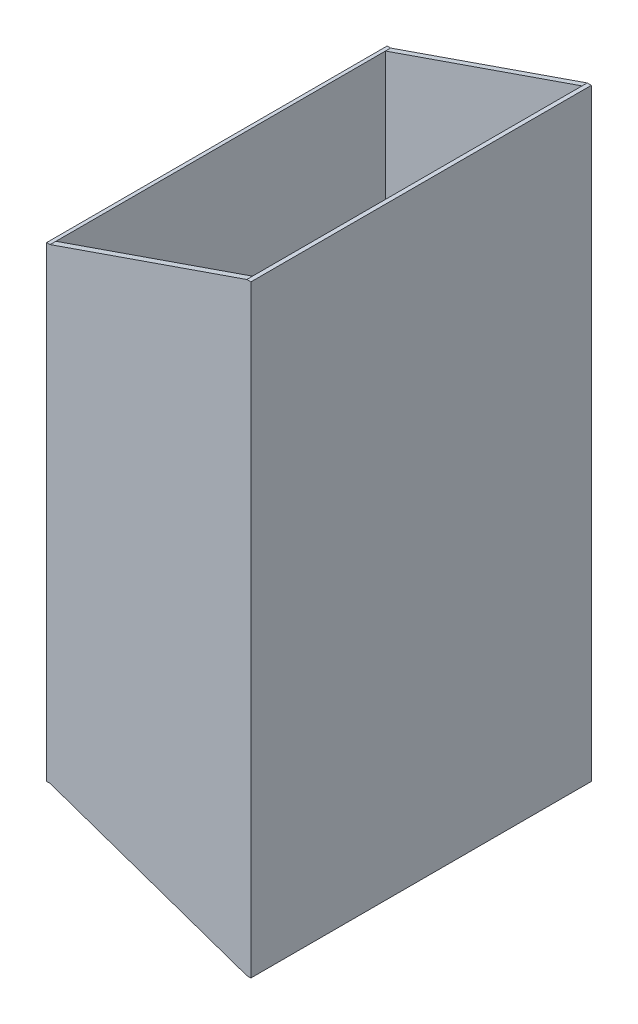
ISO-10303-21;
HEADER;
FILE_DESCRIPTION(('STEP AP214'),'2;1');
FILE_NAME('part.step','',(''),(''),'','','');
FILE_SCHEMA(('AUTOMOTIVE_DESIGN { 1 0 10303 214 1 1 1 1 }'));
ENDSEC;
DATA;
#1=APPLICATION_CONTEXT('core data for automotive mechanical design processes');
#2=APPLICATION_PROTOCOL_DEFINITION('international standard','automotive_design',2000,#1);
#3=PRODUCT_CONTEXT('',#1,'mechanical');
#4=PRODUCT('Part','Part','',(#3));
#5=PRODUCT_RELATED_PRODUCT_CATEGORY('part','',(#4));
#6=PRODUCT_DEFINITION_FORMATION('','',#4);
#7=PRODUCT_DEFINITION_CONTEXT('part definition',#1,'design');
#8=PRODUCT_DEFINITION('design','',#6,#7);
#9=PRODUCT_DEFINITION_SHAPE('','',#8);
#10=(LENGTH_UNIT() NAMED_UNIT(*) SI_UNIT(.MILLI.,.METRE.));
#11=(NAMED_UNIT(*) PLANE_ANGLE_UNIT() SI_UNIT($,.RADIAN.));
#12=(NAMED_UNIT(*) SI_UNIT($,.STERADIAN.) SOLID_ANGLE_UNIT());
#13=UNCERTAINTY_MEASURE_WITH_UNIT(LENGTH_MEASURE(1.E-05),#10,'distance_accuracy_value','');
#14=(GEOMETRIC_REPRESENTATION_CONTEXT(3) GLOBAL_UNCERTAINTY_ASSIGNED_CONTEXT((#13)) GLOBAL_UNIT_ASSIGNED_CONTEXT((#10,
#11,#12)) REPRESENTATION_CONTEXT('',''));
#15=CARTESIAN_POINT('',(0.,0.,0.));
#16=DIRECTION('',(0.,0.,1.));
#17=DIRECTION('',(1.,0.,0.));
#18=AXIS2_PLACEMENT_3D('',#15,#16,#17);
#19=CARTESIAN_POINT('',(0.,0.,25.));
#20=DIRECTION('',(0.,-1.,0.));
#21=DIRECTION('',(0.,0.,-1.));
#22=AXIS2_PLACEMENT_3D('',#19,#20,#21);
#23=PLANE('',#22);
#24=DIRECTION('',(0.,0.,-1.));
#25=VECTOR('',#24,1.);
#26=CARTESIAN_POINT('',(14.6962727145616,0.,25.));
#27=LINE('',#26,#25);
#28=CARTESIAN_POINT('',(14.6962727145616,0.,0.378852260373923));
#29=VERTEX_POINT('',#28);
#30=CARTESIAN_POINT('',(14.6962727145616,0.,0.));
#31=VERTEX_POINT('',#30);
#32=EDGE_CURVE('E251',#29,#31,#27,.T.);
#33=ORIENTED_EDGE('',*,*,#32,.T.);
#34=DIRECTION('',(-1.,0.,0.));
#35=VECTOR('',#34,1.);
#36=CARTESIAN_POINT('',(0.,0.,0.));
#37=LINE('',#36,#35);
#38=CARTESIAN_POINT('',(15.,0.,0.));
#39=VERTEX_POINT('',#38);
#40=EDGE_CURVE('E180',#39,#31,#37,.T.);
#41=ORIENTED_EDGE('',*,*,#40,.F.);
#42=DIRECTION('',(0.,0.,-1.));
#43=VECTOR('',#42,1.);
#44=CARTESIAN_POINT('',(15.,0.,25.));
#45=LINE('',#44,#43);
#46=CARTESIAN_POINT('',(15.,0.,25.));
#47=VERTEX_POINT('',#46);
#48=EDGE_CURVE('E74',#47,#39,#45,.T.);
#49=ORIENTED_EDGE('',*,*,#48,.F.);
#50=DIRECTION('',(-1.,0.,0.));
#51=VECTOR('',#50,1.);
#52=CARTESIAN_POINT('',(0.,0.,25.));
#53=LINE('',#52,#51);
#54=CARTESIAN_POINT('',(14.6962727145616,0.,25.));
#55=VERTEX_POINT('',#54);
#56=EDGE_CURVE('E193',#47,#55,#53,.T.);
#57=ORIENTED_EDGE('',*,*,#56,.T.);
#58=CARTESIAN_POINT('',(14.6962727145616,0.,24.57934087206));
#59=VERTEX_POINT('',#58);
#60=EDGE_CURVE('E250',#55,#59,#27,.T.);
#61=ORIENTED_EDGE('',*,*,#60,.T.);
#62=DIRECTION('',(0.,0.,-1.));
#63=VECTOR('',#62,1.);
#64=CARTESIAN_POINT('',(14.6962727145616,0.,0.378852260373924));
#65=LINE('',#64,#63);
#66=EDGE_CURVE('E217',#59,#29,#65,.T.);
#67=ORIENTED_EDGE('',*,*,#66,.T.);
#68=EDGE_LOOP('',(#33,#41,#49,#57,#61,#67));
#69=FACE_BOUND('',#68,.T.);
#70=ADVANCED_FACE('F46',(#69),#23,.T.);
#71=CARTESIAN_POINT('',(0.,44.2719510984474,25.));
#72=DIRECTION('',(0.,1.,0.));
#73=DIRECTION('',(0.,0.,1.));
#74=AXIS2_PLACEMENT_3D('',#71,#72,#73);
#75=PLANE('',#74);
#76=DIRECTION('',(0.,0.,-1.));
#77=VECTOR('',#76,1.);
#78=CARTESIAN_POINT('',(14.6962727145616,44.2719510984474,25.));
#79=LINE('',#78,#77);
#80=CARTESIAN_POINT('',(14.6962727145616,44.2719510984474,25.));
#81=VERTEX_POINT('',#80);
#82=CARTESIAN_POINT('',(14.6962727145616,44.2719510984474,24.57934087206));
#83=VERTEX_POINT('',#82);
#84=EDGE_CURVE('E222',#81,#83,#79,.T.);
#85=ORIENTED_EDGE('',*,*,#84,.F.);
#86=DIRECTION('',(1.,0.,0.));
#87=VECTOR('',#86,1.);
#88=CARTESIAN_POINT('',(0.,44.2719510984474,25.));
#89=LINE('',#88,#87);
#90=CARTESIAN_POINT('',(15.,44.2719510984474,25.));
#91=VERTEX_POINT('',#90);
#92=EDGE_CURVE('E63',#81,#91,#89,.T.);
#93=ORIENTED_EDGE('',*,*,#92,.T.);
#94=DIRECTION('',(0.,0.,-1.));
#95=VECTOR('',#94,1.);
#96=CARTESIAN_POINT('',(15.,44.2719510984474,25.));
#97=LINE('',#96,#95);
#98=CARTESIAN_POINT('',(15.,44.2719510984474,0.));
#99=VERTEX_POINT('',#98);
#100=EDGE_CURVE('E171',#91,#99,#97,.T.);
#101=ORIENTED_EDGE('',*,*,#100,.T.);
#102=DIRECTION('',(1.,0.,0.));
#103=VECTOR('',#102,1.);
#104=CARTESIAN_POINT('',(0.,44.2719510984474,0.));
#105=LINE('',#104,#103);
#106=CARTESIAN_POINT('',(14.6962727145616,44.2719510984474,0.));
#107=VERTEX_POINT('',#106);
#108=EDGE_CURVE('E189',#107,#99,#105,.T.);
#109=ORIENTED_EDGE('',*,*,#108,.F.);
#110=CARTESIAN_POINT('',(14.6962727145616,44.2719510984474,0.378852260373923));
#111=VERTEX_POINT('',#110);
#112=EDGE_CURVE('E224',#111,#107,#79,.T.);
#113=ORIENTED_EDGE('',*,*,#112,.F.);
#114=DIRECTION('',(0.,0.,-1.));
#115=VECTOR('',#114,1.);
#116=CARTESIAN_POINT('',(14.6962727145616,44.2719510984474,0.378852260373924));
#117=LINE('',#116,#115);
#118=EDGE_CURVE('E215',#83,#111,#117,.T.);
#119=ORIENTED_EDGE('',*,*,#118,.F.);
#120=EDGE_LOOP('',(#85,#93,#101,#109,#113,#119));
#121=FACE_BOUND('',#120,.T.);
#122=ADVANCED_FACE('F221',(#121),#75,.T.);
#123=CARTESIAN_POINT('',(15.,0.,25.));
#124=DIRECTION('',(1.,0.,0.));
#125=DIRECTION('',(0.,0.,-1.));
#126=AXIS2_PLACEMENT_3D('',#123,#124,#125);
#127=PLANE('',#126);
#128=DIRECTION('',(0.,-1.,0.));
#129=VECTOR('',#128,1.);
#130=CARTESIAN_POINT('',(15.,0.,0.));
#131=LINE('',#130,#129);
#132=EDGE_CURVE('E184',#99,#39,#131,.T.);
#133=ORIENTED_EDGE('',*,*,#132,.F.);
#134=ORIENTED_EDGE('',*,*,#100,.F.);
#135=DIRECTION('',(0.,-1.,0.));
#136=VECTOR('',#135,1.);
#137=CARTESIAN_POINT('',(15.,0.,25.));
#138=LINE('',#137,#136);
#139=EDGE_CURVE('E176',#91,#47,#138,.T.);
#140=ORIENTED_EDGE('',*,*,#139,.T.);
#141=ORIENTED_EDGE('',*,*,#48,.T.);
#142=EDGE_LOOP('',(#133,#134,#140,#141));
#143=FACE_BOUND('',#142,.T.);
#144=ADVANCED_FACE('F244',(#143),#127,.T.);
#145=CARTESIAN_POINT('',(0.,0.,25.));
#146=DIRECTION('',(-1.,0.,0.));
#147=DIRECTION('',(0.,0.,1.));
#148=AXIS2_PLACEMENT_3D('',#145,#146,#147);
#149=PLANE('',#148);
#150=DIRECTION('',(0.,0.,-1.));
#151=VECTOR('',#150,1.);
#152=CARTESIAN_POINT('',(0.,5.,25.));
#153=LINE('',#152,#151);
#154=CARTESIAN_POINT('',(0.,5.,25.));
#155=VERTEX_POINT('',#154);
#156=CARTESIAN_POINT('',(0.,5.,0.));
#157=VERTEX_POINT('',#156);
#158=EDGE_CURVE('E145',#155,#157,#153,.T.);
#159=ORIENTED_EDGE('',*,*,#158,.F.);
#160=DIRECTION('',(0.,1.,0.));
#161=VECTOR('',#160,1.);
#162=CARTESIAN_POINT('',(0.,0.,25.));
#163=LINE('',#162,#161);
#164=CARTESIAN_POINT('',(0.,39.2719510984474,25.));
#165=VERTEX_POINT('',#164);
#166=EDGE_CURVE('E160',#155,#165,#163,.T.);
#167=ORIENTED_EDGE('',*,*,#166,.T.);
#168=DIRECTION('',(0.,0.,-1.));
#169=VECTOR('',#168,1.);
#170=CARTESIAN_POINT('',(0.,39.2719510984474,25.));
#171=LINE('',#170,#169);
#172=CARTESIAN_POINT('',(0.,39.2719510984474,0.));
#173=VERTEX_POINT('',#172);
#174=EDGE_CURVE('E300',#165,#173,#171,.T.);
#175=ORIENTED_EDGE('',*,*,#174,.T.);
#176=DIRECTION('',(0.,1.,0.));
#177=VECTOR('',#176,1.);
#178=CARTESIAN_POINT('',(0.,0.,0.));
#179=LINE('',#178,#177);
#180=EDGE_CURVE('E162',#157,#173,#179,.T.);
#181=ORIENTED_EDGE('',*,*,#180,.F.);
#182=EDGE_LOOP('',(#159,#167,#175,#181));
#183=FACE_BOUND('',#182,.T.);
#184=ADVANCED_FACE('F158',(#183),#149,.T.);
#185=CARTESIAN_POINT('',(0.,0.,25.));
#186=DIRECTION('',(0.,0.,1.));
#187=DIRECTION('',(1.,0.,0.));
#188=AXIS2_PLACEMENT_3D('',#185,#186,#187);
#189=PLANE('',#188);
#190=DIRECTION('',(1.,0.,0.));
#191=VECTOR('',#190,1.);
#192=CARTESIAN_POINT('',(0.,5.,25.));
#193=LINE('',#192,#191);
#194=CARTESIAN_POINT('',(0.258481213271555,5.,25.));
#195=VERTEX_POINT('',#194);
#196=EDGE_CURVE('E142',#155,#195,#193,.T.);
#197=ORIENTED_EDGE('',*,*,#196,.T.);
#198=DIRECTION('',(0.944939472409978,-0.327245158071977,0.));
#199=VECTOR('',#198,1.);
#200=CARTESIAN_POINT('',(0.258481213271555,5.,25.));
#201=LINE('',#200,#199);
#202=EDGE_CURVE('E246',#195,#55,#201,.T.);
#203=ORIENTED_EDGE('',*,*,#202,.T.);
#204=ORIENTED_EDGE('',*,*,#56,.F.);
#205=ORIENTED_EDGE('',*,*,#139,.F.);
#206=ORIENTED_EDGE('',*,*,#92,.F.);
#207=DIRECTION('',(-0.944939472409978,-0.327245158071977,0.));
#208=VECTOR('',#207,1.);
#209=CARTESIAN_POINT('',(0.258481213271554,39.2719510984474,25.));
#210=LINE('',#209,#208);
#211=CARTESIAN_POINT('',(0.258481213271555,39.2719510984474,25.));
#212=VERTEX_POINT('',#211);
#213=EDGE_CURVE('E262',#81,#212,#210,.T.);
#214=ORIENTED_EDGE('',*,*,#213,.T.);
#215=DIRECTION('',(-1.,0.,0.));
#216=VECTOR('',#215,1.);
#217=CARTESIAN_POINT('',(0.258481213271555,39.2719510984474,25.));
#218=LINE('',#217,#216);
#219=EDGE_CURVE('E169',#212,#165,#218,.T.);
#220=ORIENTED_EDGE('',*,*,#219,.T.);
#221=ORIENTED_EDGE('',*,*,#166,.F.);
#222=EDGE_LOOP('',(#197,#203,#204,#205,#206,#214,#220,#221));
#223=FACE_BOUND('',#222,.T.);
#224=ADVANCED_FACE('F167',(#223),#189,.T.);
#225=CARTESIAN_POINT('',(0.,0.,0.));
#226=DIRECTION('',(0.,0.,1.));
#227=DIRECTION('',(1.,0.,0.));
#228=AXIS2_PLACEMENT_3D('',#225,#226,#227);
#229=PLANE('',#228);
#230=DIRECTION('',(0.944939472409978,-0.327245158071977,0.));
#231=VECTOR('',#230,1.);
#232=CARTESIAN_POINT('',(0.258481213271555,5.,0.));
#233=LINE('',#232,#231);
#234=CARTESIAN_POINT('',(0.258481213271555,5.,0.));
#235=VERTEX_POINT('',#234);
#236=EDGE_CURVE('E291',#235,#31,#233,.T.);
#237=ORIENTED_EDGE('',*,*,#236,.F.);
#238=DIRECTION('',(1.,0.,0.));
#239=VECTOR('',#238,1.);
#240=CARTESIAN_POINT('',(0.,5.,0.));
#241=LINE('',#240,#239);
#242=EDGE_CURVE('E154',#157,#235,#241,.T.);
#243=ORIENTED_EDGE('',*,*,#242,.F.);
#244=ORIENTED_EDGE('',*,*,#180,.T.);
#245=DIRECTION('',(-1.,0.,0.));
#246=VECTOR('',#245,1.);
#247=CARTESIAN_POINT('',(0.258481213271555,39.2719510984474,0.));
#248=LINE('',#247,#246);
#249=CARTESIAN_POINT('',(0.258481213271555,39.2719510984474,0.));
#250=VERTEX_POINT('',#249);
#251=EDGE_CURVE('E260',#250,#173,#248,.T.);
#252=ORIENTED_EDGE('',*,*,#251,.F.);
#253=DIRECTION('',(-0.944939472409978,-0.327245158071977,0.));
#254=VECTOR('',#253,1.);
#255=CARTESIAN_POINT('',(0.258481213271554,39.2719510984474,0.));
#256=LINE('',#255,#254);
#257=EDGE_CURVE('E258',#107,#250,#256,.T.);
#258=ORIENTED_EDGE('',*,*,#257,.F.);
#259=ORIENTED_EDGE('',*,*,#108,.T.);
#260=ORIENTED_EDGE('',*,*,#132,.T.);
#261=ORIENTED_EDGE('',*,*,#40,.T.);
#262=EDGE_LOOP('',(#237,#243,#244,#252,#258,#259,#260,#261));
#263=FACE_BOUND('',#262,.T.);
#264=ADVANCED_FACE('F254',(#263),#229,.F.);
#265=CARTESIAN_POINT('',(0.258481213271555,0.,0.378852260373924));
#266=DIRECTION('',(-1.,0.,0.));
#267=DIRECTION('',(0.,0.,1.));
#268=AXIS2_PLACEMENT_3D('',#265,#266,#267);
#269=PLANE('',#268);
#270=DIRECTION('',(0.,1.,0.));
#271=VECTOR('',#270,1.);
#272=CARTESIAN_POINT('',(0.258481213271555,0.,24.57934087206));
#273=LINE('',#272,#271);
#274=CARTESIAN_POINT('',(0.258481213271555,5.,24.57934087206));
#275=VERTEX_POINT('',#274);
#276=CARTESIAN_POINT('',(0.258481213271555,39.2719510984474,24.57934087206));
#277=VERTEX_POINT('',#276);
#278=EDGE_CURVE('E206',#275,#277,#273,.T.);
#279=ORIENTED_EDGE('',*,*,#278,.F.);
#280=DIRECTION('',(0.,0.,-1.));
#281=VECTOR('',#280,1.);
#282=CARTESIAN_POINT('',(0.258481213271555,5.,25.));
#283=LINE('',#282,#281);
#284=CARTESIAN_POINT('',(0.258481213271555,5.,0.378852260373923));
#285=VERTEX_POINT('',#284);
#286=EDGE_CURVE('E164',#275,#285,#283,.T.);
#287=ORIENTED_EDGE('',*,*,#286,.T.);
#288=DIRECTION('',(0.,1.,0.));
#289=VECTOR('',#288,1.);
#290=CARTESIAN_POINT('',(0.258481213271555,0.,0.378852260373924));
#291=LINE('',#290,#289);
#292=CARTESIAN_POINT('',(0.258481213271554,39.2719510984474,0.378852260373923));
#293=VERTEX_POINT('',#292);
#294=EDGE_CURVE('E185',#285,#293,#291,.T.);
#295=ORIENTED_EDGE('',*,*,#294,.T.);
#296=DIRECTION('',(0.,0.,-1.));
#297=VECTOR('',#296,1.);
#298=CARTESIAN_POINT('',(0.258481213271555,39.2719510984474,25.));
#299=LINE('',#298,#297);
#300=EDGE_CURVE('E281',#277,#293,#299,.T.);
#301=ORIENTED_EDGE('',*,*,#300,.F.);
#302=EDGE_LOOP('',(#279,#287,#295,#301));
#303=FACE_BOUND('',#302,.T.);
#304=ADVANCED_FACE('F317',(#303),#269,.F.);
#305=CARTESIAN_POINT('',(0.258481213271555,0.,0.378852260373924));
#306=DIRECTION('',(0.,0.,-1.));
#307=DIRECTION('',(-1.,0.,0.));
#308=AXIS2_PLACEMENT_3D('',#305,#306,#307);
#309=PLANE('',#308);
#310=ORIENTED_EDGE('',*,*,#294,.F.);
#311=DIRECTION('',(0.944939472409978,-0.327245158071977,0.));
#312=VECTOR('',#311,1.);
#313=CARTESIAN_POINT('',(1.80461554835782,4.46455303259224,0.378852260373924));
#314=LINE('',#313,#312);
#315=EDGE_CURVE('E263',#285,#29,#314,.T.);
#316=ORIENTED_EDGE('',*,*,#315,.T.);
#317=DIRECTION('',(0.,1.,0.));
#318=VECTOR('',#317,1.);
#319=CARTESIAN_POINT('',(14.6962727145616,0.,0.378852260373924));
#320=LINE('',#319,#318);
#321=EDGE_CURVE('E219',#29,#111,#320,.T.);
#322=ORIENTED_EDGE('',*,*,#321,.T.);
#323=DIRECTION('',(-0.944939472409978,-0.327245158071977,0.));
#324=VECTOR('',#323,1.);
#325=CARTESIAN_POINT('',(-11.8854611865561,35.0663416744775,0.378852260373924));
#326=LINE('',#325,#324);
#327=EDGE_CURVE('E83',#111,#293,#326,.T.);
#328=ORIENTED_EDGE('',*,*,#327,.T.);
#329=EDGE_LOOP('',(#310,#316,#322,#328));
#330=FACE_BOUND('',#329,.T.);
#331=ADVANCED_FACE('F285',(#330),#309,.F.);
#332=CARTESIAN_POINT('',(14.6962727145616,0.,0.378852260373924));
#333=DIRECTION('',(1.,0.,0.));
#334=DIRECTION('',(0.,0.,-1.));
#335=AXIS2_PLACEMENT_3D('',#332,#333,#334);
#336=PLANE('',#335);
#337=ORIENTED_EDGE('',*,*,#118,.T.);
#338=ORIENTED_EDGE('',*,*,#321,.F.);
#339=ORIENTED_EDGE('',*,*,#66,.F.);
#340=DIRECTION('',(0.,1.,0.));
#341=VECTOR('',#340,1.);
#342=CARTESIAN_POINT('',(14.6962727145616,0.,24.57934087206));
#343=LINE('',#342,#341);
#344=EDGE_CURVE('E204',#59,#83,#343,.T.);
#345=ORIENTED_EDGE('',*,*,#344,.T.);
#346=EDGE_LOOP('',(#337,#338,#339,#345));
#347=FACE_BOUND('',#346,.T.);
#348=ADVANCED_FACE('F213',(#347),#336,.F.);
#349=CARTESIAN_POINT('',(0.258481213271555,0.,24.57934087206));
#350=DIRECTION('',(0.,0.,1.));
#351=DIRECTION('',(1.,0.,0.));
#352=AXIS2_PLACEMENT_3D('',#349,#350,#351);
#353=PLANE('',#352);
#354=ORIENTED_EDGE('',*,*,#344,.F.);
#355=DIRECTION('',(-0.944939472409978,0.327245158071977,0.));
#356=VECTOR('',#355,1.);
#357=CARTESIAN_POINT('',(1.80461554835782,4.46455303259224,24.57934087206));
#358=LINE('',#357,#356);
#359=EDGE_CURVE('E12',#59,#275,#358,.T.);
#360=ORIENTED_EDGE('',*,*,#359,.T.);
#361=ORIENTED_EDGE('',*,*,#278,.T.);
#362=DIRECTION('',(0.944939472409978,0.327245158071977,0.));
#363=VECTOR('',#362,1.);
#364=CARTESIAN_POINT('',(-11.8854611865561,35.0663416744775,24.57934087206));
#365=LINE('',#364,#363);
#366=EDGE_CURVE('E55',#277,#83,#365,.T.);
#367=ORIENTED_EDGE('',*,*,#366,.T.);
#368=EDGE_LOOP('',(#354,#360,#361,#367));
#369=FACE_BOUND('',#368,.T.);
#370=ADVANCED_FACE('F203',(#369),#353,.F.);
#371=CARTESIAN_POINT('',(0.258481213271554,39.2719510984474,25.));
#372=DIRECTION('',(0.327245158071977,-0.944939472409978,0.));
#373=DIRECTION('',(0.944939472409978,0.327245158071977,0.));
#374=AXIS2_PLACEMENT_3D('',#371,#372,#373);
#375=PLANE('',#374);
#376=DIRECTION('',(0.,0.,-1.));
#377=VECTOR('',#376,1.);
#378=CARTESIAN_POINT('',(0.258481213271554,39.2719510984474,25.));
#379=LINE('',#378,#377);
#380=EDGE_CURVE('E274',#212,#277,#379,.T.);
#381=ORIENTED_EDGE('',*,*,#380,.F.);
#382=ORIENTED_EDGE('',*,*,#213,.F.);
#383=ORIENTED_EDGE('',*,*,#84,.T.);
#384=ORIENTED_EDGE('',*,*,#366,.F.);
#385=EDGE_LOOP('',(#381,#382,#383,#384));
#386=FACE_BOUND('',#385,.T.);
#387=ADVANCED_FACE('F374',(#386),#375,.F.);
#388=ORIENTED_EDGE('',*,*,#112,.T.);
#389=ORIENTED_EDGE('',*,*,#257,.T.);
#390=EDGE_CURVE('E267',#293,#250,#379,.T.);
#391=ORIENTED_EDGE('',*,*,#390,.F.);
#392=ORIENTED_EDGE('',*,*,#327,.F.);
#393=EDGE_LOOP('',(#388,#389,#391,#392));
#394=FACE_BOUND('',#393,.T.);
#395=ADVANCED_FACE('F282',(#394),#375,.F.);
#396=CARTESIAN_POINT('',(0.258481213271555,5.,25.));
#397=DIRECTION('',(0.327245158071977,0.944939472409978,0.));
#398=DIRECTION('',(-0.944939472409978,0.327245158071977,0.));
#399=AXIS2_PLACEMENT_3D('',#396,#397,#398);
#400=PLANE('',#399);
#401=ORIENTED_EDGE('',*,*,#60,.F.);
#402=ORIENTED_EDGE('',*,*,#202,.F.);
#403=DIRECTION('',(0.,0.,-1.));
#404=VECTOR('',#403,1.);
#405=CARTESIAN_POINT('',(0.258481213271555,5.,25.));
#406=LINE('',#405,#404);
#407=EDGE_CURVE('E148',#195,#275,#406,.T.);
#408=ORIENTED_EDGE('',*,*,#407,.T.);
#409=ORIENTED_EDGE('',*,*,#359,.F.);
#410=EDGE_LOOP('',(#401,#402,#408,#409));
#411=FACE_BOUND('',#410,.T.);
#412=ADVANCED_FACE('F381',(#411),#400,.F.);
#413=EDGE_CURVE('E290',#285,#235,#406,.T.);
#414=ORIENTED_EDGE('',*,*,#413,.T.);
#415=ORIENTED_EDGE('',*,*,#236,.T.);
#416=ORIENTED_EDGE('',*,*,#32,.F.);
#417=ORIENTED_EDGE('',*,*,#315,.F.);
#418=EDGE_LOOP('',(#414,#415,#416,#417));
#419=FACE_BOUND('',#418,.T.);
#420=ADVANCED_FACE('F289',(#419),#400,.F.);
#421=CARTESIAN_POINT('',(0.258481213271555,39.2719510984474,25.));
#422=DIRECTION('',(0.,-1.,0.));
#423=DIRECTION('',(0.,0.,-1.));
#424=AXIS2_PLACEMENT_3D('',#421,#422,#423);
#425=PLANE('',#424);
#426=ORIENTED_EDGE('',*,*,#251,.T.);
#427=ORIENTED_EDGE('',*,*,#174,.F.);
#428=ORIENTED_EDGE('',*,*,#219,.F.);
#429=ORIENTED_EDGE('',*,*,#380,.T.);
#430=ORIENTED_EDGE('',*,*,#300,.T.);
#431=ORIENTED_EDGE('',*,*,#390,.T.);
#432=EDGE_LOOP('',(#426,#427,#428,#429,#430,#431));
#433=FACE_BOUND('',#432,.T.);
#434=ADVANCED_FACE('F280',(#433),#425,.F.);
#435=CARTESIAN_POINT('',(0.,5.,25.));
#436=DIRECTION('',(0.,1.,0.));
#437=DIRECTION('',(0.,0.,1.));
#438=AXIS2_PLACEMENT_3D('',#435,#436,#437);
#439=PLANE('',#438);
#440=ORIENTED_EDGE('',*,*,#242,.T.);
#441=ORIENTED_EDGE('',*,*,#413,.F.);
#442=ORIENTED_EDGE('',*,*,#286,.F.);
#443=ORIENTED_EDGE('',*,*,#407,.F.);
#444=ORIENTED_EDGE('',*,*,#196,.F.);
#445=ORIENTED_EDGE('',*,*,#158,.T.);
#446=EDGE_LOOP('',(#440,#441,#442,#443,#444,#445));
#447=FACE_BOUND('',#446,.T.);
#448=ADVANCED_FACE('F144',(#447),#439,.F.);
#449=CLOSED_SHELL('',(#70,#122,#144,#184,#224,#264,#304,#331,#348,#370,#387,#395,#412,#420,#434,#448));
#450=MANIFOLD_SOLID_BREP('B2',#449);
#451=ADVANCED_BREP_SHAPE_REPRESENTATION('',(#18,#450),#14);
#452=SHAPE_DEFINITION_REPRESENTATION(#9,#451);
ENDSEC;
END-ISO-10303-21;
